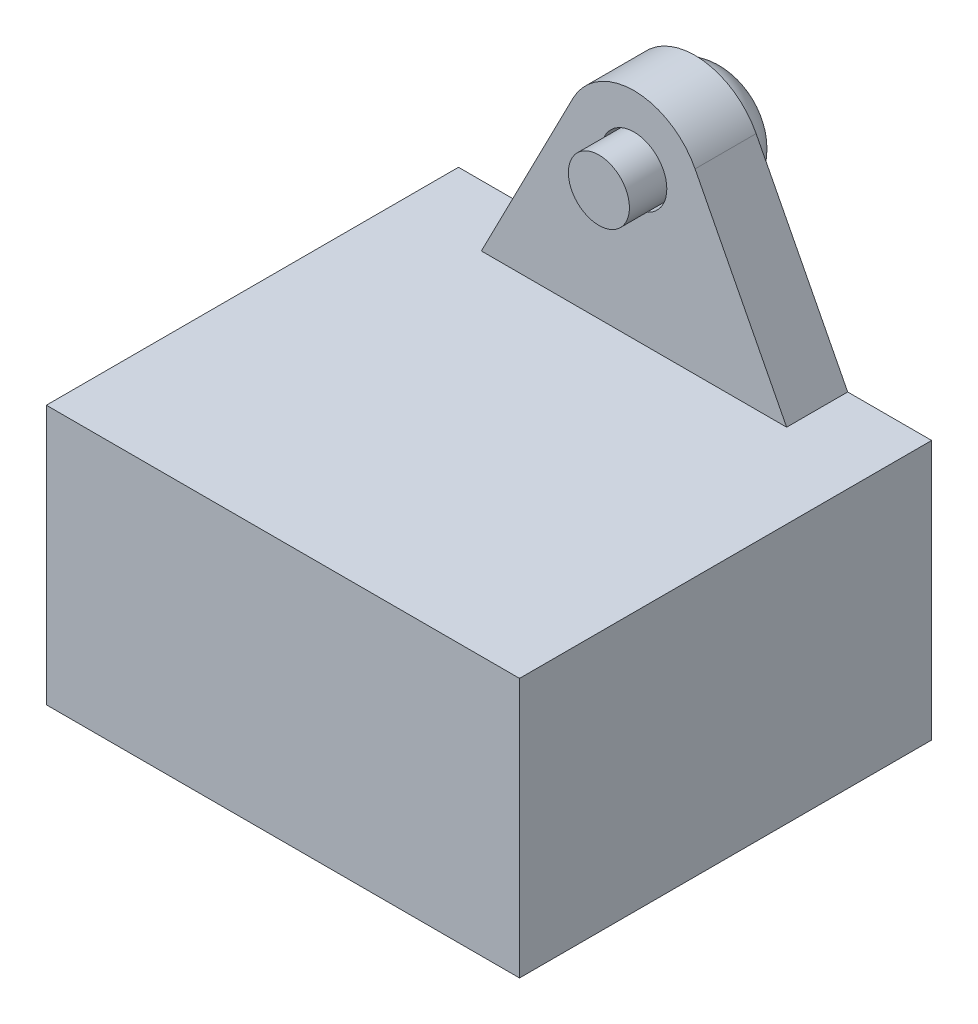
ISO-10303-21;
HEADER;
FILE_DESCRIPTION(('STEP AP214'),'2;1');
FILE_NAME('part.step','',(''),(''),'','','');
FILE_SCHEMA(('AUTOMOTIVE_DESIGN { 1 0 10303 214 1 1 1 1 }'));
ENDSEC;
DATA;
#1=APPLICATION_CONTEXT('core data for automotive mechanical design processes');
#2=APPLICATION_PROTOCOL_DEFINITION('international standard','automotive_design',2000,#1);
#3=PRODUCT_CONTEXT('',#1,'mechanical');
#4=PRODUCT('Part','Part','',(#3));
#5=PRODUCT_RELATED_PRODUCT_CATEGORY('part','',(#4));
#6=PRODUCT_DEFINITION_FORMATION('','',#4);
#7=PRODUCT_DEFINITION_CONTEXT('part definition',#1,'design');
#8=PRODUCT_DEFINITION('design','',#6,#7);
#9=PRODUCT_DEFINITION_SHAPE('','',#8);
#10=(LENGTH_UNIT() NAMED_UNIT(*) SI_UNIT(.MILLI.,.METRE.));
#11=(NAMED_UNIT(*) PLANE_ANGLE_UNIT() SI_UNIT($,.RADIAN.));
#12=(NAMED_UNIT(*) SI_UNIT($,.STERADIAN.) SOLID_ANGLE_UNIT());
#13=UNCERTAINTY_MEASURE_WITH_UNIT(LENGTH_MEASURE(1.E-05),#10,'distance_accuracy_value','');
#14=(GEOMETRIC_REPRESENTATION_CONTEXT(3) GLOBAL_UNCERTAINTY_ASSIGNED_CONTEXT((#13)) GLOBAL_UNIT_ASSIGNED_CONTEXT((#10,
#11,#12)) REPRESENTATION_CONTEXT('',''));
#15=CARTESIAN_POINT('',(0.,0.,0.));
#16=DIRECTION('',(0.,0.,1.));
#17=DIRECTION('',(1.,0.,0.));
#18=AXIS2_PLACEMENT_3D('',#15,#16,#17);
#19=CARTESIAN_POINT('',(0.,1.6,-6.2));
#20=DIRECTION('',(0.,0.,1.));
#21=DIRECTION('',(1.,0.,0.));
#22=AXIS2_PLACEMENT_3D('',#19,#20,#21);
#23=PLANE('',#22);
#24=CARTESIAN_POINT('',(0.,0.,-6.2));
#25=DIRECTION('',(0.,0.,1.));
#26=DIRECTION('',(1.,0.,0.));
#27=AXIS2_PLACEMENT_3D('',#24,#25,#26);
#28=CIRCLE('',#27,1.6);
#29=CARTESIAN_POINT('',(1.6,0.,-6.2));
#30=VERTEX_POINT('',#29);
#31=EDGE_CURVE('E170',#30,#30,#28,.T.);
#32=ORIENTED_EDGE('',*,*,#31,.F.);
#33=EDGE_LOOP('',(#32));
#34=FACE_BOUND('',#33,.T.);
#35=DIRECTION('',(-0.866025403784438,0.5,0.));
#36=VECTOR('',#35,1.);
#37=CARTESIAN_POINT('',(1.25,0.721687836487033,-6.2));
#38=LINE('',#37,#36);
#39=CARTESIAN_POINT('',(1.25,0.721687836487033,-6.2));
#40=VERTEX_POINT('',#39);
#41=CARTESIAN_POINT('',(0.,1.44337567297407,-6.2));
#42=VERTEX_POINT('',#41);
#43=EDGE_CURVE('E51',#40,#42,#38,.T.);
#44=ORIENTED_EDGE('',*,*,#43,.T.);
#45=DIRECTION('',(-0.866025403784439,-0.499999999999999,0.));
#46=VECTOR('',#45,1.);
#47=CARTESIAN_POINT('',(0.,1.44337567297407,-6.2));
#48=LINE('',#47,#46);
#49=CARTESIAN_POINT('',(-1.25,0.721687836487035,-6.2));
#50=VERTEX_POINT('',#49);
#51=EDGE_CURVE('E165',#42,#50,#48,.T.);
#52=ORIENTED_EDGE('',*,*,#51,.T.);
#53=DIRECTION('',(0.,-1.,0.));
#54=VECTOR('',#53,1.);
#55=CARTESIAN_POINT('',(-1.25,0.721687836487035,-6.2));
#56=LINE('',#55,#54);
#57=CARTESIAN_POINT('',(-1.25,-0.721687836487034,-6.2));
#58=VERTEX_POINT('',#57);
#59=EDGE_CURVE('E461',#50,#58,#56,.T.);
#60=ORIENTED_EDGE('',*,*,#59,.T.);
#61=DIRECTION('',(0.866025403784438,-0.5,0.));
#62=VECTOR('',#61,1.);
#63=CARTESIAN_POINT('',(-1.25,-0.721687836487034,-6.2));
#64=LINE('',#63,#62);
#65=CARTESIAN_POINT('',(0.,-1.44337567297407,-6.2));
#66=VERTEX_POINT('',#65);
#67=EDGE_CURVE('E458',#58,#66,#64,.T.);
#68=ORIENTED_EDGE('',*,*,#67,.T.);
#69=DIRECTION('',(0.866025403784439,0.499999999999999,0.));
#70=VECTOR('',#69,1.);
#71=CARTESIAN_POINT('',(0.,-1.44337567297407,-6.2));
#72=LINE('',#71,#70);
#73=CARTESIAN_POINT('',(1.25,-0.721687836487035,-6.2));
#74=VERTEX_POINT('',#73);
#75=EDGE_CURVE('E452',#66,#74,#72,.T.);
#76=ORIENTED_EDGE('',*,*,#75,.T.);
#77=DIRECTION('',(0.,1.,0.));
#78=VECTOR('',#77,1.);
#79=CARTESIAN_POINT('',(1.25,-0.721687836487035,-6.2));
#80=LINE('',#79,#78);
#81=EDGE_CURVE('E161',#74,#40,#80,.T.);
#82=ORIENTED_EDGE('',*,*,#81,.T.);
#83=EDGE_LOOP('',(#44,#52,#60,#68,#76,#82));
#84=FACE_BOUND('',#83,.T.);
#85=ADVANCED_FACE('F36',(#34,#84),#23,.F.);
#86=CARTESIAN_POINT('',(0.,0.,-4.));
#87=DIRECTION('',(0.,0.,1.));
#88=DIRECTION('',(1.,0.,0.));
#89=AXIS2_PLACEMENT_3D('',#86,#87,#88);
#90=PLANE('',#89);
#91=DIRECTION('',(-0.457506524864846,-0.889206263870252,0.));
#92=VECTOR('',#91,1.);
#93=CARTESIAN_POINT('',(-4.00142818741614,2.0587793618918,-4.));
#94=LINE('',#93,#92);
#95=CARTESIAN_POINT('',(-4.00142818741614,2.0587793618918,-4.));
#96=VERTEX_POINT('',#95);
#97=CARTESIAN_POINT('',(-10.,-9.6,-4.));
#98=VERTEX_POINT('',#97);
#99=EDGE_CURVE('E216',#96,#98,#94,.T.);
#100=ORIENTED_EDGE('',*,*,#99,.F.);
#101=CARTESIAN_POINT('',(0.,0.,-4.));
#102=DIRECTION('',(0.,0.,1.));
#103=DIRECTION('',(1.,0.,0.));
#104=AXIS2_PLACEMENT_3D('',#101,#102,#103);
#105=CIRCLE('',#104,4.5);
#106=CARTESIAN_POINT('',(4.00142818741614,2.0587793618918,-4.));
#107=VERTEX_POINT('',#106);
#108=EDGE_CURVE('E78',#107,#96,#105,.T.);
#109=ORIENTED_EDGE('',*,*,#108,.F.);
#110=DIRECTION('',(-0.457506524864846,0.889206263870252,0.));
#111=VECTOR('',#110,1.);
#112=CARTESIAN_POINT('',(10.,-9.6,-4.));
#113=LINE('',#112,#111);
#114=CARTESIAN_POINT('',(10.,-9.6,-4.));
#115=VERTEX_POINT('',#114);
#116=EDGE_CURVE('E293',#115,#107,#113,.T.);
#117=ORIENTED_EDGE('',*,*,#116,.F.);
#118=DIRECTION('',(-1.,0.,0.));
#119=VECTOR('',#118,1.);
#120=CARTESIAN_POINT('',(-15.5,-9.6,-4.));
#121=LINE('',#120,#119);
#122=CARTESIAN_POINT('',(15.5,-9.6,-4.));
#123=VERTEX_POINT('',#122);
#124=EDGE_CURVE('E189',#123,#115,#121,.T.);
#125=ORIENTED_EDGE('',*,*,#124,.F.);
#126=DIRECTION('',(0.,1.,0.));
#127=VECTOR('',#126,1.);
#128=CARTESIAN_POINT('',(15.5,-9.6,-4.));
#129=LINE('',#128,#127);
#130=CARTESIAN_POINT('',(15.5,-26.6,-4.));
#131=VERTEX_POINT('',#130);
#132=EDGE_CURVE('E201',#131,#123,#129,.T.);
#133=ORIENTED_EDGE('',*,*,#132,.F.);
#134=DIRECTION('',(1.,0.,0.));
#135=VECTOR('',#134,1.);
#136=CARTESIAN_POINT('',(-15.5,-26.6,-4.));
#137=LINE('',#136,#135);
#138=CARTESIAN_POINT('',(-15.5,-26.6,-4.));
#139=VERTEX_POINT('',#138);
#140=EDGE_CURVE('E199',#139,#131,#137,.T.);
#141=ORIENTED_EDGE('',*,*,#140,.F.);
#142=DIRECTION('',(0.,-1.,0.));
#143=VECTOR('',#142,1.);
#144=CARTESIAN_POINT('',(-15.5,-9.6,-4.));
#145=LINE('',#144,#143);
#146=CARTESIAN_POINT('',(-15.5,-9.6,-4.));
#147=VERTEX_POINT('',#146);
#148=EDGE_CURVE('E196',#147,#139,#145,.T.);
#149=ORIENTED_EDGE('',*,*,#148,.F.);
#150=EDGE_CURVE('E203',#98,#147,#121,.T.);
#151=ORIENTED_EDGE('',*,*,#150,.F.);
#152=EDGE_LOOP('',(#100,#109,#117,#125,#133,#141,#149,#151));
#153=FACE_BOUND('',#152,.T.);
#154=CARTESIAN_POINT('',(0.,0.,-4.));
#155=DIRECTION('',(0.,0.,1.));
#156=DIRECTION('',(1.,0.,0.));
#157=AXIS2_PLACEMENT_3D('',#154,#155,#156);
#158=CIRCLE('',#157,3.8);
#159=CARTESIAN_POINT('',(3.8,0.,-4.));
#160=VERTEX_POINT('',#159);
#161=EDGE_CURVE('E11',#160,#160,#158,.F.);
#162=ORIENTED_EDGE('',*,*,#161,.F.);
#163=EDGE_LOOP('',(#162));
#164=FACE_BOUND('',#163,.T.);
#165=ADVANCED_FACE('F235',(#153,#164),#90,.F.);
#166=CARTESIAN_POINT('',(-4.00142818741614,2.0587793618918,0.));
#167=DIRECTION('',(0.889206263870252,-0.457506524864846,0.));
#168=DIRECTION('',(0.457506524864846,0.889206263870252,0.));
#169=AXIS2_PLACEMENT_3D('',#166,#167,#168);
#170=PLANE('',#169);
#171=ORIENTED_EDGE('',*,*,#99,.T.);
#172=DIRECTION('',(0.,0.,-1.));
#173=VECTOR('',#172,1.);
#174=CARTESIAN_POINT('',(-10.,-9.6,0.));
#175=LINE('',#174,#173);
#176=CARTESIAN_POINT('',(-10.,-9.6,0.));
#177=VERTEX_POINT('',#176);
#178=EDGE_CURVE('E44',#177,#98,#175,.T.);
#179=ORIENTED_EDGE('',*,*,#178,.F.);
#180=DIRECTION('',(-0.457506524864846,-0.889206263870252,0.));
#181=VECTOR('',#180,1.);
#182=CARTESIAN_POINT('',(-4.00142818741614,2.0587793618918,0.));
#183=LINE('',#182,#181);
#184=CARTESIAN_POINT('',(-4.00142818741614,2.0587793618918,0.));
#185=VERTEX_POINT('',#184);
#186=EDGE_CURVE('E83',#185,#177,#183,.T.);
#187=ORIENTED_EDGE('',*,*,#186,.F.);
#188=DIRECTION('',(0.,0.,-1.));
#189=VECTOR('',#188,1.);
#190=CARTESIAN_POINT('',(-4.00142818741614,2.0587793618918,0.));
#191=LINE('',#190,#189);
#192=EDGE_CURVE('E308',#185,#96,#191,.T.);
#193=ORIENTED_EDGE('',*,*,#192,.T.);
#194=EDGE_LOOP('',(#171,#179,#187,#193));
#195=FACE_BOUND('',#194,.T.);
#196=ADVANCED_FACE('F38',(#195),#170,.F.);
#197=CARTESIAN_POINT('',(10.,-9.6,0.));
#198=DIRECTION('',(-0.889206263870252,-0.457506524864846,0.));
#199=DIRECTION('',(0.457506524864846,-0.889206263870252,0.));
#200=AXIS2_PLACEMENT_3D('',#197,#198,#199);
#201=PLANE('',#200);
#202=ORIENTED_EDGE('',*,*,#116,.T.);
#203=DIRECTION('',(0.,0.,-1.));
#204=VECTOR('',#203,1.);
#205=CARTESIAN_POINT('',(4.00142818741614,2.0587793618918,0.));
#206=LINE('',#205,#204);
#207=CARTESIAN_POINT('',(4.00142818741614,2.0587793618918,0.));
#208=VERTEX_POINT('',#207);
#209=EDGE_CURVE('E298',#208,#107,#206,.T.);
#210=ORIENTED_EDGE('',*,*,#209,.F.);
#211=DIRECTION('',(-0.457506524864846,0.889206263870252,0.));
#212=VECTOR('',#211,1.);
#213=CARTESIAN_POINT('',(10.,-9.6,0.));
#214=LINE('',#213,#212);
#215=CARTESIAN_POINT('',(10.,-9.6,0.));
#216=VERTEX_POINT('',#215);
#217=EDGE_CURVE('E311',#216,#208,#214,.T.);
#218=ORIENTED_EDGE('',*,*,#217,.F.);
#219=DIRECTION('',(0.,0.,-1.));
#220=VECTOR('',#219,1.);
#221=CARTESIAN_POINT('',(10.,-9.6,0.));
#222=LINE('',#221,#220);
#223=EDGE_CURVE('E247',#216,#115,#222,.T.);
#224=ORIENTED_EDGE('',*,*,#223,.T.);
#225=EDGE_LOOP('',(#202,#210,#218,#224));
#226=FACE_BOUND('',#225,.T.);
#227=ADVANCED_FACE('F320',(#226),#201,.F.);
#228=CARTESIAN_POINT('',(0.,0.,0.));
#229=DIRECTION('',(0.,0.,-1.));
#230=DIRECTION('',(-1.,0.,0.));
#231=AXIS2_PLACEMENT_3D('',#228,#229,#230);
#232=CYLINDRICAL_SURFACE('',#231,4.5);
#233=ORIENTED_EDGE('',*,*,#108,.T.);
#234=ORIENTED_EDGE('',*,*,#192,.F.);
#235=CARTESIAN_POINT('',(0.,0.,0.));
#236=DIRECTION('',(0.,0.,1.));
#237=DIRECTION('',(1.,0.,0.));
#238=AXIS2_PLACEMENT_3D('',#235,#236,#237);
#239=CIRCLE('',#238,4.5);
#240=EDGE_CURVE('E60',#208,#185,#239,.T.);
#241=ORIENTED_EDGE('',*,*,#240,.F.);
#242=ORIENTED_EDGE('',*,*,#209,.T.);
#243=EDGE_LOOP('',(#233,#234,#241,#242));
#244=FACE_BOUND('',#243,.T.);
#245=ADVANCED_FACE('F317',(#244),#232,.T.);
#246=CARTESIAN_POINT('',(0.,0.,0.));
#247=DIRECTION('',(0.,0.,1.));
#248=DIRECTION('',(1.,0.,0.));
#249=AXIS2_PLACEMENT_3D('',#246,#247,#248);
#250=PLANE('',#249);
#251=CARTESIAN_POINT('',(0.,0.,0.));
#252=DIRECTION('',(0.,0.,1.));
#253=DIRECTION('',(1.,0.,0.));
#254=AXIS2_PLACEMENT_3D('',#251,#252,#253);
#255=CIRCLE('',#254,2.15);
#256=CARTESIAN_POINT('',(2.15,0.,0.));
#257=VERTEX_POINT('',#256);
#258=EDGE_CURVE('E181',#257,#257,#255,.T.);
#259=ORIENTED_EDGE('',*,*,#258,.F.);
#260=EDGE_LOOP('',(#259));
#261=FACE_BOUND('',#260,.T.);
#262=ORIENTED_EDGE('',*,*,#186,.T.);
#263=DIRECTION('',(1.,0.,0.));
#264=VECTOR('',#263,1.);
#265=CARTESIAN_POINT('',(-10.,-9.6,0.));
#266=LINE('',#265,#264);
#267=EDGE_CURVE('E309',#177,#216,#266,.T.);
#268=ORIENTED_EDGE('',*,*,#267,.T.);
#269=ORIENTED_EDGE('',*,*,#217,.T.);
#270=ORIENTED_EDGE('',*,*,#240,.T.);
#271=EDGE_LOOP('',(#262,#268,#269,#270));
#272=FACE_BOUND('',#271,.T.);
#273=ADVANCED_FACE('F321',(#261,#272),#250,.T.);
#274=CARTESIAN_POINT('',(-15.5,-9.6,23.));
#275=DIRECTION('',(1.,0.,0.));
#276=DIRECTION('',(0.,1.,0.));
#277=AXIS2_PLACEMENT_3D('',#274,#275,#276);
#278=PLANE('',#277);
#279=ORIENTED_EDGE('',*,*,#148,.T.);
#280=DIRECTION('',(0.,0.,-1.));
#281=VECTOR('',#280,1.);
#282=CARTESIAN_POINT('',(-15.5,-26.6,23.));
#283=LINE('',#282,#281);
#284=CARTESIAN_POINT('',(-15.5,-26.6,23.));
#285=VERTEX_POINT('',#284);
#286=EDGE_CURVE('E213',#285,#139,#283,.T.);
#287=ORIENTED_EDGE('',*,*,#286,.F.);
#288=DIRECTION('',(0.,-1.,0.));
#289=VECTOR('',#288,1.);
#290=CARTESIAN_POINT('',(-15.5,-9.6,23.));
#291=LINE('',#290,#289);
#292=CARTESIAN_POINT('',(-15.5,-9.6,23.));
#293=VERTEX_POINT('',#292);
#294=EDGE_CURVE('E185',#293,#285,#291,.T.);
#295=ORIENTED_EDGE('',*,*,#294,.F.);
#296=DIRECTION('',(0.,0.,-1.));
#297=VECTOR('',#296,1.);
#298=CARTESIAN_POINT('',(-15.5,-9.6,23.));
#299=LINE('',#298,#297);
#300=EDGE_CURVE('E195',#293,#147,#299,.T.);
#301=ORIENTED_EDGE('',*,*,#300,.T.);
#302=EDGE_LOOP('',(#279,#287,#295,#301));
#303=FACE_BOUND('',#302,.T.);
#304=ADVANCED_FACE('F230',(#303),#278,.F.);
#305=CARTESIAN_POINT('',(-15.5,-26.6,23.));
#306=DIRECTION('',(0.,1.,0.));
#307=DIRECTION('',(-1.,0.,0.));
#308=AXIS2_PLACEMENT_3D('',#305,#306,#307);
#309=PLANE('',#308);
#310=ORIENTED_EDGE('',*,*,#140,.T.);
#311=DIRECTION('',(0.,0.,-1.));
#312=VECTOR('',#311,1.);
#313=CARTESIAN_POINT('',(15.5,-26.6,23.));
#314=LINE('',#313,#312);
#315=CARTESIAN_POINT('',(15.5,-26.6,23.));
#316=VERTEX_POINT('',#315);
#317=EDGE_CURVE('E217',#316,#131,#314,.T.);
#318=ORIENTED_EDGE('',*,*,#317,.F.);
#319=DIRECTION('',(1.,0.,0.));
#320=VECTOR('',#319,1.);
#321=CARTESIAN_POINT('',(-15.5,-26.6,23.));
#322=LINE('',#321,#320);
#323=EDGE_CURVE('E188',#285,#316,#322,.T.);
#324=ORIENTED_EDGE('',*,*,#323,.F.);
#325=ORIENTED_EDGE('',*,*,#286,.T.);
#326=EDGE_LOOP('',(#310,#318,#324,#325));
#327=FACE_BOUND('',#326,.T.);
#328=ADVANCED_FACE('F240',(#327),#309,.F.);
#329=CARTESIAN_POINT('',(15.5,-9.6,23.));
#330=DIRECTION('',(-1.,0.,0.));
#331=DIRECTION('',(0.,-1.,0.));
#332=AXIS2_PLACEMENT_3D('',#329,#330,#331);
#333=PLANE('',#332);
#334=ORIENTED_EDGE('',*,*,#132,.T.);
#335=DIRECTION('',(0.,0.,-1.));
#336=VECTOR('',#335,1.);
#337=CARTESIAN_POINT('',(15.5,-9.6,23.));
#338=LINE('',#337,#336);
#339=CARTESIAN_POINT('',(15.5,-9.6,23.));
#340=VERTEX_POINT('',#339);
#341=EDGE_CURVE('E219',#340,#123,#338,.T.);
#342=ORIENTED_EDGE('',*,*,#341,.F.);
#343=DIRECTION('',(0.,1.,0.));
#344=VECTOR('',#343,1.);
#345=CARTESIAN_POINT('',(15.5,-9.6,23.));
#346=LINE('',#345,#344);
#347=EDGE_CURVE('E191',#316,#340,#346,.T.);
#348=ORIENTED_EDGE('',*,*,#347,.F.);
#349=ORIENTED_EDGE('',*,*,#317,.T.);
#350=EDGE_LOOP('',(#334,#342,#348,#349));
#351=FACE_BOUND('',#350,.T.);
#352=ADVANCED_FACE('F249',(#351),#333,.F.);
#353=CARTESIAN_POINT('',(-15.5,-9.6,23.));
#354=DIRECTION('',(0.,-1.,0.));
#355=DIRECTION('',(1.,0.,0.));
#356=AXIS2_PLACEMENT_3D('',#353,#354,#355);
#357=PLANE('',#356);
#358=ORIENTED_EDGE('',*,*,#223,.F.);
#359=ORIENTED_EDGE('',*,*,#267,.F.);
#360=ORIENTED_EDGE('',*,*,#178,.T.);
#361=ORIENTED_EDGE('',*,*,#150,.T.);
#362=ORIENTED_EDGE('',*,*,#300,.F.);
#363=DIRECTION('',(-1.,0.,0.));
#364=VECTOR('',#363,1.);
#365=CARTESIAN_POINT('',(-15.5,-9.6,23.));
#366=LINE('',#365,#364);
#367=EDGE_CURVE('E193',#340,#293,#366,.T.);
#368=ORIENTED_EDGE('',*,*,#367,.F.);
#369=ORIENTED_EDGE('',*,*,#341,.T.);
#370=ORIENTED_EDGE('',*,*,#124,.T.);
#371=EDGE_LOOP('',(#358,#359,#360,#361,#362,#368,#369,#370));
#372=FACE_BOUND('',#371,.T.);
#373=ADVANCED_FACE('F245',(#372),#357,.F.);
#374=CARTESIAN_POINT('',(0.,0.,23.));
#375=DIRECTION('',(0.,0.,1.));
#376=DIRECTION('',(1.,0.,0.));
#377=AXIS2_PLACEMENT_3D('',#374,#375,#376);
#378=PLANE('',#377);
#379=ORIENTED_EDGE('',*,*,#294,.T.);
#380=ORIENTED_EDGE('',*,*,#323,.T.);
#381=ORIENTED_EDGE('',*,*,#347,.T.);
#382=ORIENTED_EDGE('',*,*,#367,.T.);
#383=EDGE_LOOP('',(#379,#380,#381,#382));
#384=FACE_BOUND('',#383,.T.);
#385=ADVANCED_FACE('F243',(#384),#378,.T.);
#386=CARTESIAN_POINT('',(0.,0.,-4.00005));
#387=DIRECTION('',(0.,0.,1.));
#388=DIRECTION('',(1.,0.,0.));
#389=AXIS2_PLACEMENT_3D('',#386,#387,#388);
#390=CYLINDRICAL_SURFACE('',#389,2.15);
#391=ORIENTED_EDGE('',*,*,#258,.T.);
#392=EDGE_LOOP('',(#391));
#393=FACE_BOUND('',#392,.T.);
#394=CARTESIAN_POINT('',(0.,0.,-4.));
#395=DIRECTION('',(0.,0.,1.));
#396=DIRECTION('',(1.,0.,0.));
#397=AXIS2_PLACEMENT_3D('',#394,#395,#396);
#398=CIRCLE('',#397,2.15);
#399=CARTESIAN_POINT('',(2.15,0.,-4.));
#400=VERTEX_POINT('',#399);
#401=EDGE_CURVE('E184',#400,#400,#398,.T.);
#402=ORIENTED_EDGE('',*,*,#401,.F.);
#403=EDGE_LOOP('',(#402));
#404=FACE_BOUND('',#403,.T.);
#405=ADVANCED_FACE('F255',(#393,#404),#390,.F.);
#406=CARTESIAN_POINT('',(0.,2.00000000000001,2.3));
#407=DIRECTION('',(0.,0.,-1.));
#408=DIRECTION('',(-1.,0.,0.));
#409=AXIS2_PLACEMENT_3D('',#406,#407,#408);
#410=PLANE('',#409);
#411=CARTESIAN_POINT('',(0.,0.,2.3));
#412=DIRECTION('',(0.,0.,1.));
#413=DIRECTION('',(1.,0.,0.));
#414=AXIS2_PLACEMENT_3D('',#411,#412,#413);
#415=CIRCLE('',#414,2.00000000000001);
#416=CARTESIAN_POINT('',(2.00000000000001,0.,2.3));
#417=VERTEX_POINT('',#416);
#418=EDGE_CURVE('E178',#417,#417,#415,.T.);
#419=ORIENTED_EDGE('',*,*,#418,.T.);
#420=EDGE_LOOP('',(#419));
#421=FACE_BOUND('',#420,.T.);
#422=ADVANCED_FACE('F272',(#421),#410,.F.);
#423=CARTESIAN_POINT('',(0.,0.,2.3));
#424=DIRECTION('',(0.,0.,1.));
#425=DIRECTION('',(1.,0.,0.));
#426=AXIS2_PLACEMENT_3D('',#423,#424,#425);
#427=CYLINDRICAL_SURFACE('',#426,2.00000000000001);
#428=ORIENTED_EDGE('',*,*,#418,.F.);
#429=EDGE_LOOP('',(#428));
#430=FACE_BOUND('',#429,.T.);
#431=CARTESIAN_POINT('',(0.,0.,-4.));
#432=DIRECTION('',(0.,0.,1.));
#433=DIRECTION('',(1.,0.,0.));
#434=AXIS2_PLACEMENT_3D('',#431,#432,#433);
#435=CIRCLE('',#434,2.00000000000001);
#436=CARTESIAN_POINT('',(2.00000000000001,0.,-4.));
#437=VERTEX_POINT('',#436);
#438=EDGE_CURVE('E166',#437,#437,#435,.T.);
#439=ORIENTED_EDGE('',*,*,#438,.T.);
#440=EDGE_LOOP('',(#439));
#441=FACE_BOUND('',#440,.T.);
#442=ADVANCED_FACE('F275',(#430,#441),#427,.T.);
#443=CARTESIAN_POINT('',(0.,3.8,-4.));
#444=DIRECTION('',(0.,0.,-1.));
#445=DIRECTION('',(-1.,0.,0.));
#446=AXIS2_PLACEMENT_3D('',#443,#444,#445);
#447=PLANE('',#446);
#448=ORIENTED_EDGE('',*,*,#438,.F.);
#449=EDGE_LOOP('',(#448));
#450=FACE_BOUND('',#449,.T.);
#451=ORIENTED_EDGE('',*,*,#401,.T.);
#452=EDGE_LOOP('',(#451));
#453=FACE_BOUND('',#452,.T.);
#454=ADVANCED_FACE('F279',(#450,#453),#447,.F.);
#455=CARTESIAN_POINT('',(0.,0.,-4.));
#456=DIRECTION('',(0.,0.,1.));
#457=DIRECTION('',(1.,0.,0.));
#458=AXIS2_PLACEMENT_3D('',#455,#456,#457);
#459=DEGENERATE_TOROIDAL_SURFACE('',#458,1.6,2.2,.T.);
#460=ORIENTED_EDGE('',*,*,#161,.T.);
#461=EDGE_LOOP('',(#460));
#462=FACE_BOUND('',#461,.T.);
#463=ORIENTED_EDGE('',*,*,#31,.T.);
#464=EDGE_LOOP('',(#463));
#465=FACE_BOUND('',#464,.T.);
#466=ADVANCED_FACE('F270',(#462,#465),#459,.T.);
#467=CARTESIAN_POINT('',(1.25,0.721687836487033,-4.9));
#468=DIRECTION('',(-0.5,-0.866025403784438,0.));
#469=DIRECTION('',(0.866025403784438,-0.5,0.));
#470=AXIS2_PLACEMENT_3D('',#467,#468,#469);
#471=PLANE('',#470);
#472=ORIENTED_EDGE('',*,*,#43,.F.);
#473=DIRECTION('',(0.,0.,-1.));
#474=VECTOR('',#473,1.);
#475=CARTESIAN_POINT('',(1.25,0.721687836487033,-4.9));
#476=LINE('',#475,#474);
#477=CARTESIAN_POINT('',(1.25,0.721687836487033,-4.9));
#478=VERTEX_POINT('',#477);
#479=EDGE_CURVE('E160',#478,#40,#476,.T.);
#480=ORIENTED_EDGE('',*,*,#479,.F.);
#481=DIRECTION('',(-0.866025403784438,0.5,0.));
#482=VECTOR('',#481,1.);
#483=CARTESIAN_POINT('',(1.25,0.721687836487033,-4.9));
#484=LINE('',#483,#482);
#485=CARTESIAN_POINT('',(0.,1.44337567297407,-4.9));
#486=VERTEX_POINT('',#485);
#487=EDGE_CURVE('E151',#478,#486,#484,.T.);
#488=ORIENTED_EDGE('',*,*,#487,.T.);
#489=DIRECTION('',(0.,0.,-1.));
#490=VECTOR('',#489,1.);
#491=CARTESIAN_POINT('',(0.,1.44337567297407,-4.9));
#492=LINE('',#491,#490);
#493=EDGE_CURVE('E159',#486,#42,#492,.T.);
#494=ORIENTED_EDGE('',*,*,#493,.T.);
#495=EDGE_LOOP('',(#472,#480,#488,#494));
#496=FACE_BOUND('',#495,.T.);
#497=ADVANCED_FACE('F158',(#496),#471,.T.);
#498=CARTESIAN_POINT('',(0.,1.44337567297407,-4.9));
#499=DIRECTION('',(0.5,-0.866025403784439,0.));
#500=DIRECTION('',(0.866025403784439,0.5,0.));
#501=AXIS2_PLACEMENT_3D('',#498,#499,#500);
#502=PLANE('',#501);
#503=ORIENTED_EDGE('',*,*,#51,.F.);
#504=ORIENTED_EDGE('',*,*,#493,.F.);
#505=DIRECTION('',(-0.866025403784439,-0.499999999999999,0.));
#506=VECTOR('',#505,1.);
#507=CARTESIAN_POINT('',(0.,1.44337567297407,-4.9));
#508=LINE('',#507,#506);
#509=CARTESIAN_POINT('',(-1.25,0.721687836487035,-4.9));
#510=VERTEX_POINT('',#509);
#511=EDGE_CURVE('E147',#486,#510,#508,.T.);
#512=ORIENTED_EDGE('',*,*,#511,.T.);
#513=DIRECTION('',(0.,0.,-1.));
#514=VECTOR('',#513,1.);
#515=CARTESIAN_POINT('',(-1.25,0.721687836487035,-4.9));
#516=LINE('',#515,#514);
#517=EDGE_CURVE('E167',#510,#50,#516,.T.);
#518=ORIENTED_EDGE('',*,*,#517,.T.);
#519=EDGE_LOOP('',(#503,#504,#512,#518));
#520=FACE_BOUND('',#519,.T.);
#521=ADVANCED_FACE('F163',(#520),#502,.T.);
#522=CARTESIAN_POINT('',(-1.25,0.721687836487035,-4.9));
#523=DIRECTION('',(1.,0.,0.));
#524=DIRECTION('',(0.,0.,-1.));
#525=AXIS2_PLACEMENT_3D('',#522,#523,#524);
#526=PLANE('',#525);
#527=ORIENTED_EDGE('',*,*,#59,.F.);
#528=ORIENTED_EDGE('',*,*,#517,.F.);
#529=DIRECTION('',(0.,-1.,0.));
#530=VECTOR('',#529,1.);
#531=CARTESIAN_POINT('',(-1.25,0.721687836487035,-4.9));
#532=LINE('',#531,#530);
#533=CARTESIAN_POINT('',(-1.25,-0.721687836487034,-4.9));
#534=VERTEX_POINT('',#533);
#535=EDGE_CURVE('E153',#510,#534,#532,.T.);
#536=ORIENTED_EDGE('',*,*,#535,.T.);
#537=DIRECTION('',(0.,0.,-1.));
#538=VECTOR('',#537,1.);
#539=CARTESIAN_POINT('',(-1.25,-0.721687836487034,-4.9));
#540=LINE('',#539,#538);
#541=EDGE_CURVE('E172',#534,#58,#540,.T.);
#542=ORIENTED_EDGE('',*,*,#541,.T.);
#543=EDGE_LOOP('',(#527,#528,#536,#542));
#544=FACE_BOUND('',#543,.T.);
#545=ADVANCED_FACE('F396',(#544),#526,.T.);
#546=CARTESIAN_POINT('',(-1.25,-0.721687836487034,-4.9));
#547=DIRECTION('',(0.5,0.866025403784438,0.));
#548=DIRECTION('',(-0.866025403784438,0.5,0.));
#549=AXIS2_PLACEMENT_3D('',#546,#547,#548);
#550=PLANE('',#549);
#551=ORIENTED_EDGE('',*,*,#67,.F.);
#552=ORIENTED_EDGE('',*,*,#541,.F.);
#553=DIRECTION('',(0.866025403784438,-0.5,0.));
#554=VECTOR('',#553,1.);
#555=CARTESIAN_POINT('',(-1.25,-0.721687836487034,-4.9));
#556=LINE('',#555,#554);
#557=CARTESIAN_POINT('',(0.,-1.44337567297407,-4.9));
#558=VERTEX_POINT('',#557);
#559=EDGE_CURVE('E477',#534,#558,#556,.T.);
#560=ORIENTED_EDGE('',*,*,#559,.T.);
#561=DIRECTION('',(0.,0.,-1.));
#562=VECTOR('',#561,1.);
#563=CARTESIAN_POINT('',(0.,-1.44337567297407,-4.9));
#564=LINE('',#563,#562);
#565=EDGE_CURVE('E468',#558,#66,#564,.T.);
#566=ORIENTED_EDGE('',*,*,#565,.T.);
#567=EDGE_LOOP('',(#551,#552,#560,#566));
#568=FACE_BOUND('',#567,.T.);
#569=ADVANCED_FACE('F405',(#568),#550,.T.);
#570=CARTESIAN_POINT('',(0.,-1.44337567297407,-4.9));
#571=DIRECTION('',(-0.499999999999999,0.866025403784439,0.));
#572=DIRECTION('',(-0.866025403784439,-0.499999999999999,0.));
#573=AXIS2_PLACEMENT_3D('',#570,#571,#572);
#574=PLANE('',#573);
#575=ORIENTED_EDGE('',*,*,#75,.F.);
#576=ORIENTED_EDGE('',*,*,#565,.F.);
#577=DIRECTION('',(0.866025403784439,0.499999999999999,0.));
#578=VECTOR('',#577,1.);
#579=CARTESIAN_POINT('',(0.,-1.44337567297407,-4.9));
#580=LINE('',#579,#578);
#581=CARTESIAN_POINT('',(1.25,-0.721687836487035,-4.9));
#582=VERTEX_POINT('',#581);
#583=EDGE_CURVE('E475',#558,#582,#580,.T.);
#584=ORIENTED_EDGE('',*,*,#583,.T.);
#585=DIRECTION('',(0.,0.,-1.));
#586=VECTOR('',#585,1.);
#587=CARTESIAN_POINT('',(1.25,-0.721687836487035,-4.9));
#588=LINE('',#587,#586);
#589=EDGE_CURVE('E451',#582,#74,#588,.T.);
#590=ORIENTED_EDGE('',*,*,#589,.T.);
#591=EDGE_LOOP('',(#575,#576,#584,#590));
#592=FACE_BOUND('',#591,.T.);
#593=ADVANCED_FACE('F415',(#592),#574,.T.);
#594=CARTESIAN_POINT('',(1.25,-0.721687836487035,-4.9));
#595=DIRECTION('',(-1.,0.,0.));
#596=DIRECTION('',(0.,0.,1.));
#597=AXIS2_PLACEMENT_3D('',#594,#595,#596);
#598=PLANE('',#597);
#599=ORIENTED_EDGE('',*,*,#81,.F.);
#600=ORIENTED_EDGE('',*,*,#589,.F.);
#601=DIRECTION('',(0.,1.,0.));
#602=VECTOR('',#601,1.);
#603=CARTESIAN_POINT('',(1.25,-0.721687836487035,-4.9));
#604=LINE('',#603,#602);
#605=EDGE_CURVE('E466',#582,#478,#604,.T.);
#606=ORIENTED_EDGE('',*,*,#605,.T.);
#607=ORIENTED_EDGE('',*,*,#479,.T.);
#608=EDGE_LOOP('',(#599,#600,#606,#607));
#609=FACE_BOUND('',#608,.T.);
#610=ADVANCED_FACE('F425',(#609),#598,.T.);
#611=CARTESIAN_POINT('',(0.,0.,-4.9));
#612=DIRECTION('',(0.,0.,1.));
#613=DIRECTION('',(1.,0.,0.));
#614=AXIS2_PLACEMENT_3D('',#611,#612,#613);
#615=PLANE('',#614);
#616=ORIENTED_EDGE('',*,*,#487,.F.);
#617=ORIENTED_EDGE('',*,*,#605,.F.);
#618=ORIENTED_EDGE('',*,*,#583,.F.);
#619=ORIENTED_EDGE('',*,*,#559,.F.);
#620=ORIENTED_EDGE('',*,*,#535,.F.);
#621=ORIENTED_EDGE('',*,*,#511,.F.);
#622=EDGE_LOOP('',(#616,#617,#618,#619,#620,#621));
#623=FACE_BOUND('',#622,.T.);
#624=ADVANCED_FACE('F149',(#623),#615,.F.);
#625=CLOSED_SHELL('',(#85,#165,#196,#227,#245,#273,#304,#328,#352,#373,#385,#405,#422,#442,#454,
#466,#497,#521,#545,#569,#593,#610,#624));
#626=MANIFOLD_SOLID_BREP('B2',#625);
#627=ADVANCED_BREP_SHAPE_REPRESENTATION('',(#18,#626),#14);
#628=SHAPE_DEFINITION_REPRESENTATION(#9,#627);
ENDSEC;
END-ISO-10303-21;
